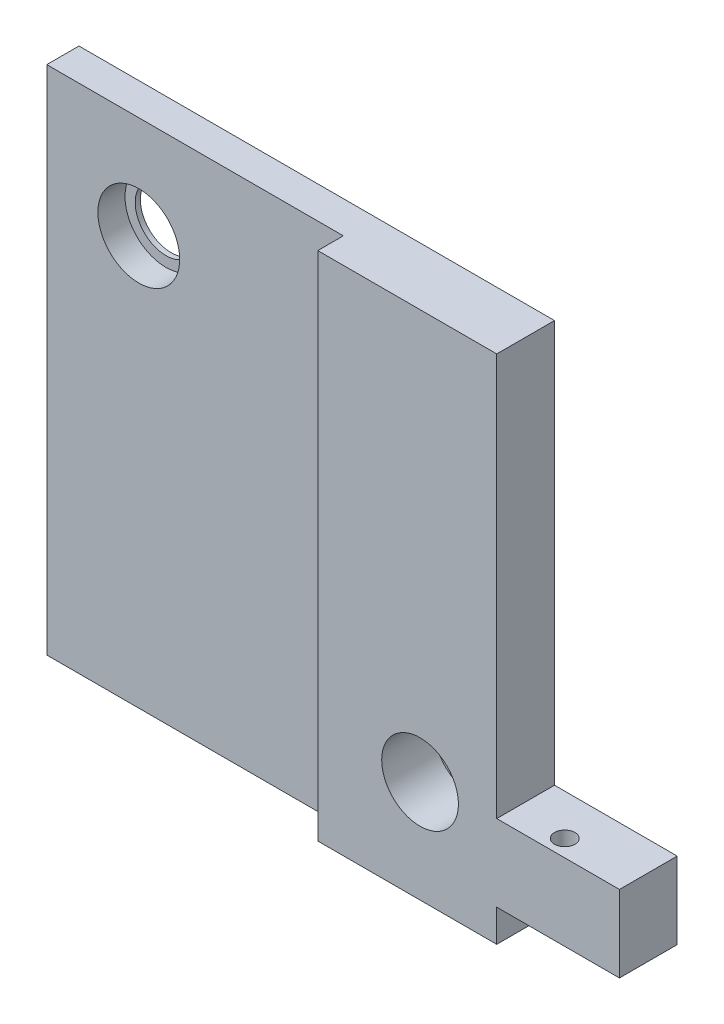
ISO-10303-21;
HEADER;
FILE_DESCRIPTION(('STEP AP214'),'2;1');
FILE_NAME('part.step','',(''),(''),'','','');
FILE_SCHEMA(('AUTOMOTIVE_DESIGN { 1 0 10303 214 1 1 1 1 }'));
ENDSEC;
DATA;
#1=APPLICATION_CONTEXT('core data for automotive mechanical design processes');
#2=APPLICATION_PROTOCOL_DEFINITION('international standard','automotive_design',2000,#1);
#3=PRODUCT_CONTEXT('',#1,'mechanical');
#4=PRODUCT('Part','Part','',(#3));
#5=PRODUCT_RELATED_PRODUCT_CATEGORY('part','',(#4));
#6=PRODUCT_DEFINITION_FORMATION('','',#4);
#7=PRODUCT_DEFINITION_CONTEXT('part definition',#1,'design');
#8=PRODUCT_DEFINITION('design','',#6,#7);
#9=PRODUCT_DEFINITION_SHAPE('','',#8);
#10=(LENGTH_UNIT() NAMED_UNIT(*) SI_UNIT(.MILLI.,.METRE.));
#11=(NAMED_UNIT(*) PLANE_ANGLE_UNIT() SI_UNIT($,.RADIAN.));
#12=(NAMED_UNIT(*) SI_UNIT($,.STERADIAN.) SOLID_ANGLE_UNIT());
#13=UNCERTAINTY_MEASURE_WITH_UNIT(LENGTH_MEASURE(1.E-05),#10,'distance_accuracy_value','');
#14=(GEOMETRIC_REPRESENTATION_CONTEXT(3) GLOBAL_UNCERTAINTY_ASSIGNED_CONTEXT((#13)) GLOBAL_UNIT_ASSIGNED_CONTEXT((#10,
#11,#12)) REPRESENTATION_CONTEXT('',''));
#15=CARTESIAN_POINT('',(0.,0.,0.));
#16=DIRECTION('',(0.,0.,1.));
#17=DIRECTION('',(1.,0.,0.));
#18=AXIS2_PLACEMENT_3D('',#15,#16,#17);
#19=CARTESIAN_POINT('',(1.81294964028778,-15.0719424460432,-55.));
#20=DIRECTION('',(0.,0.,1.));
#21=DIRECTION('',(-1.,0.,0.));
#22=AXIS2_PLACEMENT_3D('',#19,#20,#21);
#23=CYLINDRICAL_SURFACE('',#22,7.5);
#24=CARTESIAN_POINT('',(1.81294964028778,-15.0719424460432,-5.));
#25=DIRECTION('',(0.,0.,-1.));
#26=DIRECTION('',(-1.,0.,0.));
#27=AXIS2_PLACEMENT_3D('',#24,#25,#26);
#28=CIRCLE('',#27,7.5);
#29=CARTESIAN_POINT('',(-5.68705035971222,-15.0719424460432,-5.));
#30=VERTEX_POINT('',#29);
#31=EDGE_CURVE('E413',#30,#30,#28,.T.);
#32=ORIENTED_EDGE('',*,*,#31,.F.);
#33=EDGE_LOOP('',(#32));
#34=FACE_BOUND('',#33,.T.);
#35=CARTESIAN_POINT('',(1.81294964028778,-15.0719424460432,-15.3));
#36=DIRECTION('',(0.,0.,1.));
#37=DIRECTION('',(1.,0.,0.));
#38=AXIS2_PLACEMENT_3D('',#35,#36,#37);
#39=CIRCLE('',#38,7.5);
#40=CARTESIAN_POINT('',(9.31294964028777,-15.0719424460432,-15.3));
#41=VERTEX_POINT('',#40);
#42=EDGE_CURVE('E11',#41,#41,#39,.F.);
#43=ORIENTED_EDGE('',*,*,#42,.T.);
#44=EDGE_LOOP('',(#43));
#45=FACE_BOUND('',#44,.T.);
#46=ADVANCED_FACE('F35',(#34,#45),#23,.F.);
#47=CARTESIAN_POINT('',(-58.1870503597123,44.9280575539568,-60.));
#48=DIRECTION('',(0.,0.,1.));
#49=DIRECTION('',(-1.,0.,0.));
#50=AXIS2_PLACEMENT_3D('',#47,#48,#49);
#51=CYLINDRICAL_SURFACE('',#50,8.);
#52=CARTESIAN_POINT('',(-58.1870503597123,44.9280575539568,-10.));
#53=DIRECTION('',(0.,0.,-1.));
#54=DIRECTION('',(-1.,0.,0.));
#55=AXIS2_PLACEMENT_3D('',#52,#53,#54);
#56=CIRCLE('',#55,8.);
#57=CARTESIAN_POINT('',(-66.1870503597122,44.9280575539568,-10.));
#58=VERTEX_POINT('',#57);
#59=EDGE_CURVE('E408',#58,#58,#56,.T.);
#60=ORIENTED_EDGE('',*,*,#59,.F.);
#61=EDGE_LOOP('',(#60));
#62=FACE_BOUND('',#61,.T.);
#63=CARTESIAN_POINT('',(-58.1870503597123,44.9280575539568,-15.3));
#64=DIRECTION('',(0.,0.,1.));
#65=DIRECTION('',(1.,0.,0.));
#66=AXIS2_PLACEMENT_3D('',#63,#64,#65);
#67=CIRCLE('',#66,8.);
#68=CARTESIAN_POINT('',(-50.1870503597123,44.9280575539568,-15.3));
#69=VERTEX_POINT('',#68);
#70=EDGE_CURVE('E43',#69,#69,#67,.F.);
#71=ORIENTED_EDGE('',*,*,#70,.T.);
#72=EDGE_LOOP('',(#71));
#73=FACE_BOUND('',#72,.T.);
#74=ADVANCED_FACE('F197',(#62,#73),#51,.F.);
#75=CARTESIAN_POINT('',(16.8129496402878,64.9280575539568,-16.3));
#76=DIRECTION('',(1.,0.,0.));
#77=DIRECTION('',(0.,1.,0.));
#78=AXIS2_PLACEMENT_3D('',#75,#76,#77);
#79=PLANE('',#78);
#80=DIRECTION('',(0.,0.,-1.));
#81=VECTOR('',#80,1.);
#82=CARTESIAN_POINT('',(16.8129496402878,-13.7719424460432,-16.3));
#83=LINE('',#82,#81);
#84=CARTESIAN_POINT('',(16.8129496402878,-13.7719424460432,-5.));
#85=VERTEX_POINT('',#84);
#86=CARTESIAN_POINT('',(16.8129496402878,-13.7719424460432,-16.3));
#87=VERTEX_POINT('',#86);
#88=EDGE_CURVE('E132',#85,#87,#83,.T.);
#89=ORIENTED_EDGE('',*,*,#88,.T.);
#90=DIRECTION('',(0.,-1.,0.));
#91=VECTOR('',#90,1.);
#92=CARTESIAN_POINT('',(16.8129496402878,64.9280575539568,-16.3));
#93=LINE('',#92,#91);
#94=CARTESIAN_POINT('',(16.8129496402878,64.9280575539568,-16.3));
#95=VERTEX_POINT('',#94);
#96=EDGE_CURVE('E174',#95,#87,#93,.T.);
#97=ORIENTED_EDGE('',*,*,#96,.F.);
#98=DIRECTION('',(0.,0.,1.));
#99=VECTOR('',#98,1.);
#100=CARTESIAN_POINT('',(16.8129496402878,64.9280575539568,-16.3));
#101=LINE('',#100,#99);
#102=CARTESIAN_POINT('',(16.8129496402878,64.9280575539568,-5.));
#103=VERTEX_POINT('',#102);
#104=EDGE_CURVE('E187',#95,#103,#101,.T.);
#105=ORIENTED_EDGE('',*,*,#104,.T.);
#106=DIRECTION('',(0.,-1.,0.));
#107=VECTOR('',#106,1.);
#108=CARTESIAN_POINT('',(16.8129496402878,64.9280575539568,-5.));
#109=LINE('',#108,#107);
#110=EDGE_CURVE('E148',#103,#85,#109,.T.);
#111=ORIENTED_EDGE('',*,*,#110,.T.);
#112=EDGE_LOOP('',(#89,#97,#105,#111));
#113=FACE_BOUND('',#112,.T.);
#114=ADVANCED_FACE('F222',(#113),#79,.T.);
#115=CARTESIAN_POINT('',(0.,0.,-10.));
#116=DIRECTION('',(0.,0.,-1.));
#117=DIRECTION('',(1.,0.,0.));
#118=AXIS2_PLACEMENT_3D('',#115,#116,#117);
#119=PLANE('',#118);
#120=ORIENTED_EDGE('',*,*,#59,.T.);
#121=EDGE_LOOP('',(#120));
#122=FACE_BOUND('',#121,.T.);
#123=DIRECTION('',(0.,1.,0.));
#124=VECTOR('',#123,1.);
#125=CARTESIAN_POINT('',(-18.1870503597122,64.9280575539568,-10.));
#126=LINE('',#125,#124);
#127=CARTESIAN_POINT('',(-18.1870503597123,-35.0719424460432,-10.));
#128=VERTEX_POINT('',#127);
#129=CARTESIAN_POINT('',(-18.1870503597122,64.9280575539568,-10.));
#130=VERTEX_POINT('',#129);
#131=EDGE_CURVE('E126',#128,#130,#126,.T.);
#132=ORIENTED_EDGE('',*,*,#131,.T.);
#133=DIRECTION('',(1.,0.,0.));
#134=VECTOR('',#133,1.);
#135=CARTESIAN_POINT('',(-76.1870503597122,64.9280575539568,-10.));
#136=LINE('',#135,#134);
#137=CARTESIAN_POINT('',(-76.1870503597122,64.9280575539568,-10.));
#138=VERTEX_POINT('',#137);
#139=EDGE_CURVE('E170',#138,#130,#136,.T.);
#140=ORIENTED_EDGE('',*,*,#139,.F.);
#141=DIRECTION('',(0.,-1.,0.));
#142=VECTOR('',#141,1.);
#143=CARTESIAN_POINT('',(-76.1870503597122,64.9280575539568,-10.));
#144=LINE('',#143,#142);
#145=CARTESIAN_POINT('',(-76.1870503597122,-35.0719424460432,-10.));
#146=VERTEX_POINT('',#145);
#147=EDGE_CURVE('E165',#138,#146,#144,.T.);
#148=ORIENTED_EDGE('',*,*,#147,.T.);
#149=DIRECTION('',(1.,0.,0.));
#150=VECTOR('',#149,1.);
#151=CARTESIAN_POINT('',(-76.1870503597122,-35.0719424460432,-10.));
#152=LINE('',#151,#150);
#153=EDGE_CURVE('E181',#146,#128,#152,.T.);
#154=ORIENTED_EDGE('',*,*,#153,.T.);
#155=EDGE_LOOP('',(#132,#140,#148,#154));
#156=FACE_BOUND('',#155,.T.);
#157=ADVANCED_FACE('F247',(#122,#156),#119,.F.);
#158=CARTESIAN_POINT('',(-76.1870503597122,64.9280575539568,-16.3));
#159=DIRECTION('',(1.,0.,0.));
#160=DIRECTION('',(0.,0.,1.));
#161=AXIS2_PLACEMENT_3D('',#158,#159,#160);
#162=PLANE('',#161);
#163=ORIENTED_EDGE('',*,*,#147,.F.);
#164=DIRECTION('',(0.,0.,1.));
#165=VECTOR('',#164,1.);
#166=CARTESIAN_POINT('',(-76.1870503597122,64.9280575539568,-16.3));
#167=LINE('',#166,#165);
#168=CARTESIAN_POINT('',(-76.1870503597122,64.9280575539568,-16.3));
#169=VERTEX_POINT('',#168);
#170=EDGE_CURVE('E178',#169,#138,#167,.T.);
#171=ORIENTED_EDGE('',*,*,#170,.F.);
#172=DIRECTION('',(0.,-1.,0.));
#173=VECTOR('',#172,1.);
#174=CARTESIAN_POINT('',(-76.1870503597122,64.9280575539568,-16.3));
#175=LINE('',#174,#173);
#176=CARTESIAN_POINT('',(-76.1870503597122,-35.0719424460432,-16.3));
#177=VERTEX_POINT('',#176);
#178=EDGE_CURVE('E166',#169,#177,#175,.T.);
#179=ORIENTED_EDGE('',*,*,#178,.T.);
#180=DIRECTION('',(0.,0.,1.));
#181=VECTOR('',#180,1.);
#182=CARTESIAN_POINT('',(-76.1870503597122,-35.0719424460432,-16.3));
#183=LINE('',#182,#181);
#184=EDGE_CURVE('E193',#177,#146,#183,.T.);
#185=ORIENTED_EDGE('',*,*,#184,.T.);
#186=EDGE_LOOP('',(#163,#171,#179,#185));
#187=FACE_BOUND('',#186,.T.);
#188=ADVANCED_FACE('F37',(#187),#162,.F.);
#189=CARTESIAN_POINT('',(-76.1870503597122,-35.0719424460432,-16.3));
#190=DIRECTION('',(0.,1.,0.));
#191=DIRECTION('',(0.,0.,-1.));
#192=AXIS2_PLACEMENT_3D('',#189,#190,#191);
#193=PLANE('',#192);
#194=ORIENTED_EDGE('',*,*,#153,.F.);
#195=ORIENTED_EDGE('',*,*,#184,.F.);
#196=DIRECTION('',(1.,0.,0.));
#197=VECTOR('',#196,1.);
#198=CARTESIAN_POINT('',(-76.1870503597122,-35.0719424460432,-16.3));
#199=LINE('',#198,#197);
#200=CARTESIAN_POINT('',(16.8129496402878,-35.0719424460432,-16.3));
#201=VERTEX_POINT('',#200);
#202=EDGE_CURVE('E169',#177,#201,#199,.T.);
#203=ORIENTED_EDGE('',*,*,#202,.T.);
#204=DIRECTION('',(0.,0.,1.));
#205=VECTOR('',#204,1.);
#206=CARTESIAN_POINT('',(16.8129496402878,-35.0719424460432,-16.3));
#207=LINE('',#206,#205);
#208=CARTESIAN_POINT('',(16.8129496402877,-35.0719424460432,-5.));
#209=VERTEX_POINT('',#208);
#210=EDGE_CURVE('E190',#201,#209,#207,.T.);
#211=ORIENTED_EDGE('',*,*,#210,.T.);
#212=DIRECTION('',(-1.,0.,0.));
#213=VECTOR('',#212,1.);
#214=CARTESIAN_POINT('',(16.8129496402877,-35.0719424460432,-5.));
#215=LINE('',#214,#213);
#216=CARTESIAN_POINT('',(-18.1870503597123,-35.0719424460432,-5.));
#217=VERTEX_POINT('',#216);
#218=EDGE_CURVE('E151',#209,#217,#215,.T.);
#219=ORIENTED_EDGE('',*,*,#218,.T.);
#220=DIRECTION('',(0.,0.,-1.));
#221=VECTOR('',#220,1.);
#222=CARTESIAN_POINT('',(-18.1870503597123,-35.0719424460432,-5.));
#223=LINE('',#222,#221);
#224=EDGE_CURVE('E163',#217,#128,#223,.T.);
#225=ORIENTED_EDGE('',*,*,#224,.T.);
#226=EDGE_LOOP('',(#194,#195,#203,#211,#219,#225));
#227=FACE_BOUND('',#226,.T.);
#228=ADVANCED_FACE('F256',(#227),#193,.F.);
#229=DIRECTION('',(0.,0.,1.));
#230=VECTOR('',#229,1.);
#231=CARTESIAN_POINT('',(16.8129496402878,-28.7719424460432,-16.3));
#232=LINE('',#231,#230);
#233=CARTESIAN_POINT('',(16.8129496402878,-28.7719424460432,-16.3));
#234=VERTEX_POINT('',#233);
#235=CARTESIAN_POINT('',(16.8129496402878,-28.7719424460432,-5.));
#236=VERTEX_POINT('',#235);
#237=EDGE_CURVE('E125',#234,#236,#232,.T.);
#238=ORIENTED_EDGE('',*,*,#237,.T.);
#239=EDGE_CURVE('E152',#236,#209,#109,.T.);
#240=ORIENTED_EDGE('',*,*,#239,.T.);
#241=ORIENTED_EDGE('',*,*,#210,.F.);
#242=EDGE_CURVE('E173',#234,#201,#93,.T.);
#243=ORIENTED_EDGE('',*,*,#242,.F.);
#244=EDGE_LOOP('',(#238,#240,#241,#243));
#245=FACE_BOUND('',#244,.T.);
#246=ADVANCED_FACE('F253',(#245),#79,.T.);
#247=CARTESIAN_POINT('',(-76.1870503597122,64.9280575539568,-16.3));
#248=DIRECTION('',(0.,1.,0.));
#249=DIRECTION('',(0.,0.,-1.));
#250=AXIS2_PLACEMENT_3D('',#247,#248,#249);
#251=PLANE('',#250);
#252=ORIENTED_EDGE('',*,*,#139,.T.);
#253=DIRECTION('',(0.,0.,-1.));
#254=VECTOR('',#253,1.);
#255=CARTESIAN_POINT('',(-18.1870503597122,64.9280575539568,-5.));
#256=LINE('',#255,#254);
#257=CARTESIAN_POINT('',(-18.1870503597122,64.9280575539568,-5.));
#258=VERTEX_POINT('',#257);
#259=EDGE_CURVE('E159',#258,#130,#256,.T.);
#260=ORIENTED_EDGE('',*,*,#259,.F.);
#261=DIRECTION('',(1.,0.,0.));
#262=VECTOR('',#261,1.);
#263=CARTESIAN_POINT('',(16.8129496402878,64.9280575539568,-5.));
#264=LINE('',#263,#262);
#265=EDGE_CURVE('E157',#258,#103,#264,.T.);
#266=ORIENTED_EDGE('',*,*,#265,.T.);
#267=ORIENTED_EDGE('',*,*,#104,.F.);
#268=DIRECTION('',(1.,0.,0.));
#269=VECTOR('',#268,1.);
#270=CARTESIAN_POINT('',(-76.1870503597122,64.9280575539568,-16.3));
#271=LINE('',#270,#269);
#272=EDGE_CURVE('E176',#169,#95,#271,.T.);
#273=ORIENTED_EDGE('',*,*,#272,.F.);
#274=ORIENTED_EDGE('',*,*,#170,.T.);
#275=EDGE_LOOP('',(#252,#260,#266,#267,#273,#274));
#276=FACE_BOUND('',#275,.T.);
#277=ADVANCED_FACE('F246',(#276),#251,.T.);
#278=CARTESIAN_POINT('',(0.,0.,-16.3));
#279=DIRECTION('',(0.,0.,-1.));
#280=DIRECTION('',(1.,0.,0.));
#281=AXIS2_PLACEMENT_3D('',#278,#279,#280);
#282=PLANE('',#281);
#283=ORIENTED_EDGE('',*,*,#178,.F.);
#284=ORIENTED_EDGE('',*,*,#272,.T.);
#285=ORIENTED_EDGE('',*,*,#96,.T.);
#286=DIRECTION('',(-1.,0.,0.));
#287=VECTOR('',#286,1.);
#288=CARTESIAN_POINT('',(40.8129496402878,-13.7719424460432,-16.3));
#289=LINE('',#288,#287);
#290=CARTESIAN_POINT('',(40.8129496402878,-13.7719424460432,-16.3));
#291=VERTEX_POINT('',#290);
#292=EDGE_CURVE('E58',#291,#87,#289,.T.);
#293=ORIENTED_EDGE('',*,*,#292,.F.);
#294=DIRECTION('',(0.,-1.,0.));
#295=VECTOR('',#294,1.);
#296=CARTESIAN_POINT('',(40.8129496402878,-13.7719424460432,-16.3));
#297=LINE('',#296,#295);
#298=CARTESIAN_POINT('',(40.8129496402878,-28.7719424460432,-16.3));
#299=VERTEX_POINT('',#298);
#300=EDGE_CURVE('E116',#291,#299,#297,.T.);
#301=ORIENTED_EDGE('',*,*,#300,.T.);
#302=DIRECTION('',(-1.,0.,0.));
#303=VECTOR('',#302,1.);
#304=CARTESIAN_POINT('',(40.8129496402878,-28.7719424460432,-16.3));
#305=LINE('',#304,#303);
#306=EDGE_CURVE('E50',#299,#234,#305,.T.);
#307=ORIENTED_EDGE('',*,*,#306,.T.);
#308=ORIENTED_EDGE('',*,*,#242,.T.);
#309=ORIENTED_EDGE('',*,*,#202,.F.);
#310=EDGE_LOOP('',(#283,#284,#285,#293,#301,#307,#308,#309));
#311=FACE_BOUND('',#310,.T.);
#312=CARTESIAN_POINT('',(-58.1870503597123,44.9280575539568,-16.3));
#313=DIRECTION('',(0.,0.,1.));
#314=DIRECTION('',(1.,0.,0.));
#315=AXIS2_PLACEMENT_3D('',#312,#313,#314);
#316=CIRCLE('',#315,6.);
#317=CARTESIAN_POINT('',(-52.1870503597123,44.9280575539568,-16.3));
#318=VERTEX_POINT('',#317);
#319=EDGE_CURVE('E402',#318,#318,#316,.T.);
#320=ORIENTED_EDGE('',*,*,#319,.T.);
#321=EDGE_LOOP('',(#320));
#322=FACE_BOUND('',#321,.T.);
#323=CARTESIAN_POINT('',(1.81294964028778,-15.0719424460432,-16.3));
#324=DIRECTION('',(0.,0.,1.));
#325=DIRECTION('',(1.,0.,0.));
#326=AXIS2_PLACEMENT_3D('',#323,#324,#325);
#327=CIRCLE('',#326,5.5);
#328=CARTESIAN_POINT('',(7.31294964028777,-15.0719424460432,-16.3));
#329=VERTEX_POINT('',#328);
#330=EDGE_CURVE('E399',#329,#329,#327,.T.);
#331=ORIENTED_EDGE('',*,*,#330,.T.);
#332=EDGE_LOOP('',(#331));
#333=FACE_BOUND('',#332,.T.);
#334=ADVANCED_FACE('F130',(#311,#322,#333),#282,.T.);
#335=CARTESIAN_POINT('',(-18.1870503597122,64.9280575539568,-5.));
#336=DIRECTION('',(1.,0.,0.));
#337=DIRECTION('',(0.,1.,0.));
#338=AXIS2_PLACEMENT_3D('',#335,#336,#337);
#339=PLANE('',#338);
#340=ORIENTED_EDGE('',*,*,#131,.F.);
#341=ORIENTED_EDGE('',*,*,#224,.F.);
#342=DIRECTION('',(0.,1.,0.));
#343=VECTOR('',#342,1.);
#344=CARTESIAN_POINT('',(-18.1870503597122,64.9280575539568,-5.));
#345=LINE('',#344,#343);
#346=EDGE_CURVE('E155',#217,#258,#345,.T.);
#347=ORIENTED_EDGE('',*,*,#346,.T.);
#348=ORIENTED_EDGE('',*,*,#259,.T.);
#349=EDGE_LOOP('',(#340,#341,#347,#348));
#350=FACE_BOUND('',#349,.T.);
#351=ADVANCED_FACE('F239',(#350),#339,.F.);
#352=CARTESIAN_POINT('',(0.,0.,-5.));
#353=DIRECTION('',(0.,0.,1.));
#354=DIRECTION('',(-1.,0.,0.));
#355=AXIS2_PLACEMENT_3D('',#352,#353,#354);
#356=PLANE('',#355);
#357=ORIENTED_EDGE('',*,*,#31,.T.);
#358=EDGE_LOOP('',(#357));
#359=FACE_BOUND('',#358,.T.);
#360=ORIENTED_EDGE('',*,*,#110,.F.);
#361=ORIENTED_EDGE('',*,*,#265,.F.);
#362=ORIENTED_EDGE('',*,*,#346,.F.);
#363=ORIENTED_EDGE('',*,*,#218,.F.);
#364=ORIENTED_EDGE('',*,*,#239,.F.);
#365=DIRECTION('',(-1.,0.,0.));
#366=VECTOR('',#365,1.);
#367=CARTESIAN_POINT('',(40.8129496402878,-28.7719424460432,-5.));
#368=LINE('',#367,#366);
#369=CARTESIAN_POINT('',(40.8129496402878,-28.7719424460432,-5.));
#370=VERTEX_POINT('',#369);
#371=EDGE_CURVE('E127',#370,#236,#368,.T.);
#372=ORIENTED_EDGE('',*,*,#371,.F.);
#373=DIRECTION('',(0.,1.,0.));
#374=VECTOR('',#373,1.);
#375=CARTESIAN_POINT('',(40.8129496402878,-13.7719424460432,-5.));
#376=LINE('',#375,#374);
#377=CARTESIAN_POINT('',(40.8129496402878,-13.7719424460432,-5.));
#378=VERTEX_POINT('',#377);
#379=EDGE_CURVE('E118',#370,#378,#376,.T.);
#380=ORIENTED_EDGE('',*,*,#379,.T.);
#381=DIRECTION('',(-1.,0.,0.));
#382=VECTOR('',#381,1.);
#383=CARTESIAN_POINT('',(40.8129496402878,-13.7719424460432,-5.));
#384=LINE('',#383,#382);
#385=EDGE_CURVE('E145',#378,#85,#384,.T.);
#386=ORIENTED_EDGE('',*,*,#385,.T.);
#387=EDGE_LOOP('',(#360,#361,#362,#363,#364,#372,#380,#386));
#388=FACE_BOUND('',#387,.T.);
#389=ADVANCED_FACE('F235',(#359,#388),#356,.T.);
#390=CARTESIAN_POINT('',(40.8129496402878,-28.7719424460432,-16.3));
#391=DIRECTION('',(0.,1.,0.));
#392=DIRECTION('',(-1.,0.,0.));
#393=AXIS2_PLACEMENT_3D('',#390,#391,#392);
#394=PLANE('',#393);
#395=CARTESIAN_POINT('',(26.8129496402877,-28.7719424460432,-8.3));
#396=DIRECTION('',(0.,-1.,0.));
#397=DIRECTION('',(-1.,0.,0.));
#398=AXIS2_PLACEMENT_3D('',#395,#396,#397);
#399=CIRCLE('',#398,2.);
#400=CARTESIAN_POINT('',(24.8129496402878,-28.7719424460432,-8.3));
#401=VERTEX_POINT('',#400);
#402=EDGE_CURVE('E137',#401,#401,#399,.T.);
#403=ORIENTED_EDGE('',*,*,#402,.F.);
#404=EDGE_LOOP('',(#403));
#405=FACE_BOUND('',#404,.T.);
#406=ORIENTED_EDGE('',*,*,#237,.F.);
#407=ORIENTED_EDGE('',*,*,#306,.F.);
#408=DIRECTION('',(0.,0.,1.));
#409=VECTOR('',#408,1.);
#410=CARTESIAN_POINT('',(40.8129496402878,-28.7719424460432,-16.3));
#411=LINE('',#410,#409);
#412=EDGE_CURVE('E114',#299,#370,#411,.T.);
#413=ORIENTED_EDGE('',*,*,#412,.T.);
#414=ORIENTED_EDGE('',*,*,#371,.T.);
#415=EDGE_LOOP('',(#406,#407,#413,#414));
#416=FACE_BOUND('',#415,.T.);
#417=ADVANCED_FACE('F123',(#405,#416),#394,.F.);
#418=CARTESIAN_POINT('',(40.8129496402878,-13.7719424460432,-16.3));
#419=DIRECTION('',(0.,-1.,0.));
#420=DIRECTION('',(1.,0.,0.));
#421=AXIS2_PLACEMENT_3D('',#418,#419,#420);
#422=PLANE('',#421);
#423=CARTESIAN_POINT('',(26.8129496402877,-13.7719424460432,-8.3));
#424=DIRECTION('',(0.,-1.,0.));
#425=DIRECTION('',(-1.,0.,0.));
#426=AXIS2_PLACEMENT_3D('',#423,#424,#425);
#427=CIRCLE('',#426,2.);
#428=CARTESIAN_POINT('',(24.8129496402878,-13.7719424460432,-8.3));
#429=VERTEX_POINT('',#428);
#430=EDGE_CURVE('E415',#429,#429,#427,.T.);
#431=ORIENTED_EDGE('',*,*,#430,.T.);
#432=EDGE_LOOP('',(#431));
#433=FACE_BOUND('',#432,.T.);
#434=ORIENTED_EDGE('',*,*,#88,.F.);
#435=ORIENTED_EDGE('',*,*,#385,.F.);
#436=DIRECTION('',(0.,0.,-1.));
#437=VECTOR('',#436,1.);
#438=CARTESIAN_POINT('',(40.8129496402878,-13.7719424460432,-16.3));
#439=LINE('',#438,#437);
#440=EDGE_CURVE('E141',#378,#291,#439,.T.);
#441=ORIENTED_EDGE('',*,*,#440,.T.);
#442=ORIENTED_EDGE('',*,*,#292,.T.);
#443=EDGE_LOOP('',(#434,#435,#441,#442));
#444=FACE_BOUND('',#443,.T.);
#445=ADVANCED_FACE('F229',(#433,#444),#422,.F.);
#446=CARTESIAN_POINT('',(40.8129496402878,0.,-10.));
#447=DIRECTION('',(1.,0.,0.));
#448=DIRECTION('',(0.,1.,0.));
#449=AXIS2_PLACEMENT_3D('',#446,#447,#448);
#450=PLANE('',#449);
#451=ORIENTED_EDGE('',*,*,#300,.F.);
#452=ORIENTED_EDGE('',*,*,#440,.F.);
#453=ORIENTED_EDGE('',*,*,#379,.F.);
#454=ORIENTED_EDGE('',*,*,#412,.F.);
#455=EDGE_LOOP('',(#451,#452,#453,#454));
#456=FACE_BOUND('',#455,.T.);
#457=ADVANCED_FACE('F115',(#456),#450,.T.);
#458=CARTESIAN_POINT('',(26.8129496402878,-63.7719424460432,-8.3));
#459=DIRECTION('',(0.,1.,0.));
#460=DIRECTION('',(-1.,0.,0.));
#461=AXIS2_PLACEMENT_3D('',#458,#459,#460);
#462=CYLINDRICAL_SURFACE('',#461,2.);
#463=ORIENTED_EDGE('',*,*,#430,.F.);
#464=EDGE_LOOP('',(#463));
#465=FACE_BOUND('',#464,.T.);
#466=ORIENTED_EDGE('',*,*,#402,.T.);
#467=EDGE_LOOP('',(#466));
#468=FACE_BOUND('',#467,.T.);
#469=ADVANCED_FACE('F202',(#465,#468),#462,.F.);
#470=CARTESIAN_POINT('',(-58.1870503597123,44.9280575539568,-15.3));
#471=DIRECTION('',(0.,0.,-1.));
#472=DIRECTION('',(1.,0.,0.));
#473=AXIS2_PLACEMENT_3D('',#470,#471,#472);
#474=PLANE('',#473);
#475=CARTESIAN_POINT('',(-58.1870503597123,44.9280575539568,-15.3));
#476=DIRECTION('',(0.,0.,1.));
#477=DIRECTION('',(1.,0.,0.));
#478=AXIS2_PLACEMENT_3D('',#475,#476,#477);
#479=CIRCLE('',#478,6.);
#480=CARTESIAN_POINT('',(-52.1870503597123,44.9280575539568,-15.3));
#481=VERTEX_POINT('',#480);
#482=EDGE_CURVE('E405',#481,#481,#479,.T.);
#483=ORIENTED_EDGE('',*,*,#482,.F.);
#484=EDGE_LOOP('',(#483));
#485=FACE_BOUND('',#484,.T.);
#486=ORIENTED_EDGE('',*,*,#70,.F.);
#487=EDGE_LOOP('',(#486));
#488=FACE_BOUND('',#487,.T.);
#489=ADVANCED_FACE('F199',(#485,#488),#474,.F.);
#490=CARTESIAN_POINT('',(-58.1870503597123,44.9280575539568,-15.3));
#491=DIRECTION('',(0.,0.,-1.));
#492=DIRECTION('',(1.,0.,0.));
#493=AXIS2_PLACEMENT_3D('',#490,#491,#492);
#494=CYLINDRICAL_SURFACE('',#493,6.);
#495=ORIENTED_EDGE('',*,*,#482,.T.);
#496=EDGE_LOOP('',(#495));
#497=FACE_BOUND('',#496,.T.);
#498=ORIENTED_EDGE('',*,*,#319,.F.);
#499=EDGE_LOOP('',(#498));
#500=FACE_BOUND('',#499,.T.);
#501=ADVANCED_FACE('F201',(#497,#500),#494,.F.);
#502=CARTESIAN_POINT('',(1.81294964028778,-15.0719424460432,-15.3));
#503=DIRECTION('',(0.,0.,-1.));
#504=DIRECTION('',(1.,0.,0.));
#505=AXIS2_PLACEMENT_3D('',#502,#503,#504);
#506=PLANE('',#505);
#507=CARTESIAN_POINT('',(1.81294964028778,-15.0719424460432,-15.3));
#508=DIRECTION('',(0.,0.,1.));
#509=DIRECTION('',(1.,0.,0.));
#510=AXIS2_PLACEMENT_3D('',#507,#508,#509);
#511=CIRCLE('',#510,5.5);
#512=CARTESIAN_POINT('',(7.31294964028777,-15.0719424460432,-15.3));
#513=VERTEX_POINT('',#512);
#514=EDGE_CURVE('E396',#513,#513,#511,.T.);
#515=ORIENTED_EDGE('',*,*,#514,.F.);
#516=EDGE_LOOP('',(#515));
#517=FACE_BOUND('',#516,.T.);
#518=ORIENTED_EDGE('',*,*,#42,.F.);
#519=EDGE_LOOP('',(#518));
#520=FACE_BOUND('',#519,.T.);
#521=ADVANCED_FACE('F209',(#517,#520),#506,.F.);
#522=CARTESIAN_POINT('',(1.81294964028778,-15.0719424460432,-15.3));
#523=DIRECTION('',(0.,0.,-1.));
#524=DIRECTION('',(1.,0.,0.));
#525=AXIS2_PLACEMENT_3D('',#522,#523,#524);
#526=CYLINDRICAL_SURFACE('',#525,5.5);
#527=ORIENTED_EDGE('',*,*,#514,.T.);
#528=EDGE_LOOP('',(#527));
#529=FACE_BOUND('',#528,.T.);
#530=ORIENTED_EDGE('',*,*,#330,.F.);
#531=EDGE_LOOP('',(#530));
#532=FACE_BOUND('',#531,.T.);
#533=ADVANCED_FACE('F379',(#529,#532),#526,.F.);
#534=CLOSED_SHELL('',(#46,#74,#114,#157,#188,#228,#246,#277,#334,#351,#389,#417,#445,#457,#469,
#489,#501,#521,#533));
#535=MANIFOLD_SOLID_BREP('B2',#534);
#536=ADVANCED_BREP_SHAPE_REPRESENTATION('',(#18,#535),#14);
#537=SHAPE_DEFINITION_REPRESENTATION(#9,#536);
ENDSEC;
END-ISO-10303-21;
